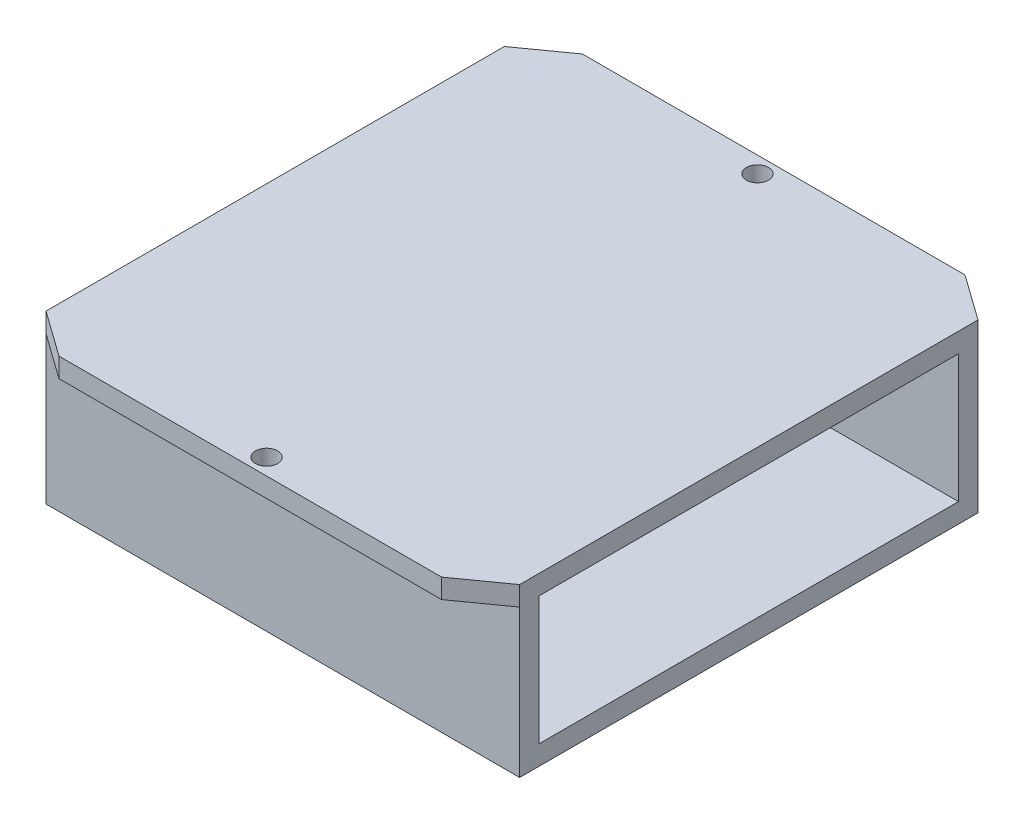
ISO-10303-21;
HEADER;
FILE_DESCRIPTION(('STEP AP214'),'2;1');
FILE_NAME('part.step','',(''),(''),'','','');
FILE_SCHEMA(('AUTOMOTIVE_DESIGN { 1 0 10303 214 1 1 1 1 }'));
ENDSEC;
DATA;
#1=APPLICATION_CONTEXT('core data for automotive mechanical design processes');
#2=APPLICATION_PROTOCOL_DEFINITION('international standard','automotive_design',2000,#1);
#3=PRODUCT_CONTEXT('',#1,'mechanical');
#4=PRODUCT('Part','Part','',(#3));
#5=PRODUCT_RELATED_PRODUCT_CATEGORY('part','',(#4));
#6=PRODUCT_DEFINITION_FORMATION('','',#4);
#7=PRODUCT_DEFINITION_CONTEXT('part definition',#1,'design');
#8=PRODUCT_DEFINITION('design','',#6,#7);
#9=PRODUCT_DEFINITION_SHAPE('','',#8);
#10=(LENGTH_UNIT() NAMED_UNIT(*) SI_UNIT(.MILLI.,.METRE.));
#11=(NAMED_UNIT(*) PLANE_ANGLE_UNIT() SI_UNIT($,.RADIAN.));
#12=(NAMED_UNIT(*) SI_UNIT($,.STERADIAN.) SOLID_ANGLE_UNIT());
#13=UNCERTAINTY_MEASURE_WITH_UNIT(LENGTH_MEASURE(1.E-05),#10,'distance_accuracy_value','');
#14=(GEOMETRIC_REPRESENTATION_CONTEXT(3) GLOBAL_UNCERTAINTY_ASSIGNED_CONTEXT((#13)) GLOBAL_UNIT_ASSIGNED_CONTEXT((#10,
#11,#12)) REPRESENTATION_CONTEXT('',''));
#15=CARTESIAN_POINT('',(0.,0.,0.));
#16=DIRECTION('',(0.,0.,1.));
#17=DIRECTION('',(1.,0.,0.));
#18=AXIS2_PLACEMENT_3D('',#15,#16,#17);
#19=CARTESIAN_POINT('',(69.85,0.,0.));
#20=DIRECTION('',(-1.,0.,0.));
#21=DIRECTION('',(0.,0.,1.));
#22=AXIS2_PLACEMENT_3D('',#19,#20,#21);
#23=PLANE('',#22);
#24=DIRECTION('',(0.,-1.,0.));
#25=VECTOR('',#24,1.);
#26=CARTESIAN_POINT('',(69.85,-3.,3.));
#27=LINE('',#26,#25);
#28=CARTESIAN_POINT('',(69.85,22.7,3.));
#29=VERTEX_POINT('',#28);
#30=CARTESIAN_POINT('',(69.85,19.7,3.));
#31=VERTEX_POINT('',#30);
#32=EDGE_CURVE('E253',#29,#31,#27,.T.);
#33=ORIENTED_EDGE('',*,*,#32,.T.);
#34=CARTESIAN_POINT('',(69.85,-3.,3.));
#35=VERTEX_POINT('',#34);
#36=EDGE_CURVE('E252',#31,#35,#27,.T.);
#37=ORIENTED_EDGE('',*,*,#36,.T.);
#38=DIRECTION('',(0.,0.,-1.));
#39=VECTOR('',#38,1.);
#40=CARTESIAN_POINT('',(69.85,-3.,3.));
#41=LINE('',#40,#39);
#42=CARTESIAN_POINT('',(69.85,-3.,-67.5));
#43=VERTEX_POINT('',#42);
#44=EDGE_CURVE('E256',#35,#43,#41,.T.);
#45=ORIENTED_EDGE('',*,*,#44,.T.);
#46=DIRECTION('',(0.,1.,0.));
#47=VECTOR('',#46,1.);
#48=CARTESIAN_POINT('',(69.85,-3.,-67.5));
#49=LINE('',#48,#47);
#50=CARTESIAN_POINT('',(69.85,19.7,-67.5));
#51=VERTEX_POINT('',#50);
#52=EDGE_CURVE('E258',#43,#51,#49,.T.);
#53=ORIENTED_EDGE('',*,*,#52,.T.);
#54=DIRECTION('',(0.,1.,0.));
#55=VECTOR('',#54,1.);
#56=CARTESIAN_POINT('',(69.85,19.7,-67.5));
#57=LINE('',#56,#55);
#58=CARTESIAN_POINT('',(69.85,22.7,-67.5));
#59=VERTEX_POINT('',#58);
#60=EDGE_CURVE('E150',#51,#59,#57,.T.);
#61=ORIENTED_EDGE('',*,*,#60,.T.);
#62=DIRECTION('',(0.,0.,1.));
#63=VECTOR('',#62,1.);
#64=CARTESIAN_POINT('',(69.85,22.7,3.));
#65=LINE('',#64,#63);
#66=EDGE_CURVE('E261',#59,#29,#65,.T.);
#67=ORIENTED_EDGE('',*,*,#66,.T.);
#68=EDGE_LOOP('',(#33,#37,#45,#53,#61,#67));
#69=FACE_BOUND('',#68,.T.);
#70=DIRECTION('',(0.,-1.,0.));
#71=VECTOR('',#70,1.);
#72=CARTESIAN_POINT('',(69.85,0.,0.));
#73=LINE('',#72,#71);
#74=CARTESIAN_POINT('',(69.85,19.7,0.));
#75=VERTEX_POINT('',#74);
#76=CARTESIAN_POINT('',(69.85,0.,0.));
#77=VERTEX_POINT('',#76);
#78=EDGE_CURVE('E221',#75,#77,#73,.T.);
#79=ORIENTED_EDGE('',*,*,#78,.F.);
#80=DIRECTION('',(0.,0.,1.));
#81=VECTOR('',#80,1.);
#82=CARTESIAN_POINT('',(69.85,19.7,0.));
#83=LINE('',#82,#81);
#84=CARTESIAN_POINT('',(69.85,19.7,-64.5));
#85=VERTEX_POINT('',#84);
#86=EDGE_CURVE('E229',#85,#75,#83,.T.);
#87=ORIENTED_EDGE('',*,*,#86,.F.);
#88=DIRECTION('',(0.,1.,0.));
#89=VECTOR('',#88,1.);
#90=CARTESIAN_POINT('',(69.85,0.,-64.5));
#91=LINE('',#90,#89);
#92=CARTESIAN_POINT('',(69.85,0.,-64.5));
#93=VERTEX_POINT('',#92);
#94=EDGE_CURVE('E226',#93,#85,#91,.T.);
#95=ORIENTED_EDGE('',*,*,#94,.F.);
#96=DIRECTION('',(0.,0.,-1.));
#97=VECTOR('',#96,1.);
#98=CARTESIAN_POINT('',(69.85,0.,0.));
#99=LINE('',#98,#97);
#100=EDGE_CURVE('E223',#77,#93,#99,.T.);
#101=ORIENTED_EDGE('',*,*,#100,.F.);
#102=EDGE_LOOP('',(#79,#87,#95,#101));
#103=FACE_BOUND('',#102,.T.);
#104=ADVANCED_FACE('F39',(#69,#103),#23,.F.);
#105=CARTESIAN_POINT('',(69.85,-3.,3.));
#106=DIRECTION('',(0.,0.,-1.));
#107=DIRECTION('',(-1.,0.,0.));
#108=AXIS2_PLACEMENT_3D('',#105,#106,#107);
#109=PLANE('',#108);
#110=ORIENTED_EDGE('',*,*,#36,.F.);
#111=DIRECTION('',(-1.,0.,0.));
#112=VECTOR('',#111,1.);
#113=CARTESIAN_POINT('',(-3.,19.7,3.));
#114=LINE('',#113,#112);
#115=CARTESIAN_POINT('',(-3.,19.7,3.));
#116=VERTEX_POINT('',#115);
#117=EDGE_CURVE('E197',#31,#116,#114,.T.);
#118=ORIENTED_EDGE('',*,*,#117,.T.);
#119=DIRECTION('',(0.,1.,0.));
#120=VECTOR('',#119,1.);
#121=CARTESIAN_POINT('',(-3.,-3.,3.));
#122=LINE('',#121,#120);
#123=CARTESIAN_POINT('',(-3.,-3.,3.));
#124=VERTEX_POINT('',#123);
#125=EDGE_CURVE('E210',#124,#116,#122,.T.);
#126=ORIENTED_EDGE('',*,*,#125,.F.);
#127=DIRECTION('',(-1.,0.,0.));
#128=VECTOR('',#127,1.);
#129=CARTESIAN_POINT('',(69.85,-3.,3.));
#130=LINE('',#129,#128);
#131=EDGE_CURVE('E11',#35,#124,#130,.T.);
#132=ORIENTED_EDGE('',*,*,#131,.F.);
#133=EDGE_LOOP('',(#110,#118,#126,#132));
#134=FACE_BOUND('',#133,.T.);
#135=ADVANCED_FACE('F41',(#134),#109,.F.);
#136=CARTESIAN_POINT('',(69.85,-3.,3.));
#137=DIRECTION('',(0.,1.,0.));
#138=DIRECTION('',(0.,0.,1.));
#139=AXIS2_PLACEMENT_3D('',#136,#137,#138);
#140=PLANE('',#139);
#141=ORIENTED_EDGE('',*,*,#131,.T.);
#142=DIRECTION('',(0.,0.,1.));
#143=VECTOR('',#142,1.);
#144=CARTESIAN_POINT('',(-3.,-3.,-67.5));
#145=LINE('',#144,#143);
#146=CARTESIAN_POINT('',(-3.,-3.,-67.5));
#147=VERTEX_POINT('',#146);
#148=EDGE_CURVE('E172',#147,#124,#145,.T.);
#149=ORIENTED_EDGE('',*,*,#148,.F.);
#150=DIRECTION('',(-1.,0.,0.));
#151=VECTOR('',#150,1.);
#152=CARTESIAN_POINT('',(69.85,-3.,-67.5));
#153=LINE('',#152,#151);
#154=EDGE_CURVE('E47',#43,#147,#153,.T.);
#155=ORIENTED_EDGE('',*,*,#154,.F.);
#156=ORIENTED_EDGE('',*,*,#44,.F.);
#157=EDGE_LOOP('',(#141,#149,#155,#156));
#158=FACE_BOUND('',#157,.T.);
#159=ADVANCED_FACE('F272',(#158),#140,.F.);
#160=CARTESIAN_POINT('',(69.85,-3.,-67.5));
#161=DIRECTION('',(0.,0.,1.));
#162=DIRECTION('',(1.,0.,0.));
#163=AXIS2_PLACEMENT_3D('',#160,#161,#162);
#164=PLANE('',#163);
#165=DIRECTION('',(0.,-1.,0.));
#166=VECTOR('',#165,1.);
#167=CARTESIAN_POINT('',(-3.,22.7,-67.5));
#168=LINE('',#167,#166);
#169=CARTESIAN_POINT('',(-3.,19.7,-67.5));
#170=VERTEX_POINT('',#169);
#171=EDGE_CURVE('E216',#170,#147,#168,.T.);
#172=ORIENTED_EDGE('',*,*,#171,.F.);
#173=DIRECTION('',(1.,0.,0.));
#174=VECTOR('',#173,1.);
#175=CARTESIAN_POINT('',(-3.,19.7,-67.5));
#176=LINE('',#175,#174);
#177=EDGE_CURVE('E159',#170,#51,#176,.T.);
#178=ORIENTED_EDGE('',*,*,#177,.T.);
#179=ORIENTED_EDGE('',*,*,#52,.F.);
#180=ORIENTED_EDGE('',*,*,#154,.T.);
#181=EDGE_LOOP('',(#172,#178,#179,#180));
#182=FACE_BOUND('',#181,.T.);
#183=ADVANCED_FACE('F269',(#182),#164,.F.);
#184=CARTESIAN_POINT('',(69.85,22.7,3.));
#185=DIRECTION('',(0.,-1.,0.));
#186=DIRECTION('',(0.,0.,-1.));
#187=AXIS2_PLACEMENT_3D('',#184,#185,#186);
#188=PLANE('',#187);
#189=ORIENTED_EDGE('',*,*,#66,.F.);
#190=DIRECTION('',(-0.813733471206735,0.,-0.581238193719096));
#191=VECTOR('',#190,1.);
#192=CARTESIAN_POINT('',(69.85,22.7,-67.5));
#193=LINE('',#192,#191);
#194=CARTESIAN_POINT('',(62.85,22.7,-72.5));
#195=VERTEX_POINT('',#194);
#196=EDGE_CURVE('E166',#59,#195,#193,.T.);
#197=ORIENTED_EDGE('',*,*,#196,.T.);
#198=DIRECTION('',(-1.,0.,0.));
#199=VECTOR('',#198,1.);
#200=CARTESIAN_POINT('',(62.85,22.7,-72.5));
#201=LINE('',#200,#199);
#202=CARTESIAN_POINT('',(4.,22.7,-72.5));
#203=VERTEX_POINT('',#202);
#204=EDGE_CURVE('E146',#195,#203,#201,.T.);
#205=ORIENTED_EDGE('',*,*,#204,.T.);
#206=DIRECTION('',(-0.813733471206735,0.,0.581238193719096));
#207=VECTOR('',#206,1.);
#208=CARTESIAN_POINT('',(4.,22.7,-72.5));
#209=LINE('',#208,#207);
#210=CARTESIAN_POINT('',(-3.,22.7,-67.5));
#211=VERTEX_POINT('',#210);
#212=EDGE_CURVE('E161',#203,#211,#209,.T.);
#213=ORIENTED_EDGE('',*,*,#212,.T.);
#214=DIRECTION('',(0.,0.,-1.));
#215=VECTOR('',#214,1.);
#216=CARTESIAN_POINT('',(-3.,22.7,3.));
#217=LINE('',#216,#215);
#218=CARTESIAN_POINT('',(-3.,22.7,3.));
#219=VERTEX_POINT('',#218);
#220=EDGE_CURVE('E213',#219,#211,#217,.T.);
#221=ORIENTED_EDGE('',*,*,#220,.F.);
#222=DIRECTION('',(0.813733471206735,0.,0.581238193719096));
#223=VECTOR('',#222,1.);
#224=CARTESIAN_POINT('',(4.,22.7,8.00000000000001));
#225=LINE('',#224,#223);
#226=CARTESIAN_POINT('',(4.,22.7,8.00000000000001));
#227=VERTEX_POINT('',#226);
#228=EDGE_CURVE('E186',#219,#227,#225,.T.);
#229=ORIENTED_EDGE('',*,*,#228,.T.);
#230=DIRECTION('',(1.,0.,0.));
#231=VECTOR('',#230,1.);
#232=CARTESIAN_POINT('',(62.85,22.7,8.00000000000001));
#233=LINE('',#232,#231);
#234=CARTESIAN_POINT('',(62.85,22.7,8.00000000000001));
#235=VERTEX_POINT('',#234);
#236=EDGE_CURVE('E183',#227,#235,#233,.T.);
#237=ORIENTED_EDGE('',*,*,#236,.T.);
#238=DIRECTION('',(0.813733471206735,0.,-0.581238193719096));
#239=VECTOR('',#238,1.);
#240=CARTESIAN_POINT('',(69.85,22.7,3.));
#241=LINE('',#240,#239);
#242=EDGE_CURVE('E190',#235,#29,#241,.T.);
#243=ORIENTED_EDGE('',*,*,#242,.T.);
#244=EDGE_LOOP('',(#189,#197,#205,#213,#221,#229,#237,#243));
#245=FACE_BOUND('',#244,.T.);
#246=CARTESIAN_POINT('',(33.425,22.7,-70.));
#247=DIRECTION('',(0.,1.,0.));
#248=DIRECTION('',(0.,0.,1.));
#249=AXIS2_PLACEMENT_3D('',#246,#247,#248);
#250=CIRCLE('',#249,1.69999999999999);
#251=CARTESIAN_POINT('',(33.425,22.7,-68.3));
#252=VERTEX_POINT('',#251);
#253=EDGE_CURVE('E205',#252,#252,#250,.T.);
#254=ORIENTED_EDGE('',*,*,#253,.F.);
#255=EDGE_LOOP('',(#254));
#256=FACE_BOUND('',#255,.T.);
#257=CARTESIAN_POINT('',(33.425,22.7,5.50000000000001));
#258=DIRECTION('',(0.,1.,0.));
#259=DIRECTION('',(0.,0.,-1.));
#260=AXIS2_PLACEMENT_3D('',#257,#258,#259);
#261=CIRCLE('',#260,1.69999999999999);
#262=CARTESIAN_POINT('',(33.425,22.7,3.80000000000001));
#263=VERTEX_POINT('',#262);
#264=EDGE_CURVE('E202',#263,#263,#261,.T.);
#265=ORIENTED_EDGE('',*,*,#264,.F.);
#266=EDGE_LOOP('',(#265));
#267=FACE_BOUND('',#266,.T.);
#268=ADVANCED_FACE('F283',(#245,#256,#267),#188,.F.);
#269=CARTESIAN_POINT('',(69.85,0.,0.));
#270=DIRECTION('',(0.,0.,-1.));
#271=DIRECTION('',(-1.,0.,0.));
#272=AXIS2_PLACEMENT_3D('',#269,#270,#271);
#273=PLANE('',#272);
#274=DIRECTION('',(0.,-1.,0.));
#275=VECTOR('',#274,1.);
#276=CARTESIAN_POINT('',(0.,0.,0.));
#277=LINE('',#276,#275);
#278=CARTESIAN_POINT('',(0.,19.7,0.));
#279=VERTEX_POINT('',#278);
#280=CARTESIAN_POINT('',(0.,0.,0.));
#281=VERTEX_POINT('',#280);
#282=EDGE_CURVE('E220',#279,#281,#277,.T.);
#283=ORIENTED_EDGE('',*,*,#282,.F.);
#284=DIRECTION('',(-1.,0.,0.));
#285=VECTOR('',#284,1.);
#286=CARTESIAN_POINT('',(69.85,19.7,0.));
#287=LINE('',#286,#285);
#288=EDGE_CURVE('E231',#75,#279,#287,.T.);
#289=ORIENTED_EDGE('',*,*,#288,.F.);
#290=ORIENTED_EDGE('',*,*,#78,.T.);
#291=DIRECTION('',(-1.,0.,0.));
#292=VECTOR('',#291,1.);
#293=CARTESIAN_POINT('',(69.85,0.,0.));
#294=LINE('',#293,#292);
#295=EDGE_CURVE('E249',#77,#281,#294,.T.);
#296=ORIENTED_EDGE('',*,*,#295,.T.);
#297=EDGE_LOOP('',(#283,#289,#290,#296));
#298=FACE_BOUND('',#297,.T.);
#299=ADVANCED_FACE('F318',(#298),#273,.T.);
#300=CARTESIAN_POINT('',(69.85,0.,0.));
#301=DIRECTION('',(0.,1.,0.));
#302=DIRECTION('',(0.,0.,1.));
#303=AXIS2_PLACEMENT_3D('',#300,#301,#302);
#304=PLANE('',#303);
#305=DIRECTION('',(0.,0.,-1.));
#306=VECTOR('',#305,1.);
#307=CARTESIAN_POINT('',(0.,0.,0.));
#308=LINE('',#307,#306);
#309=CARTESIAN_POINT('',(0.,0.,-64.5));
#310=VERTEX_POINT('',#309);
#311=EDGE_CURVE('E234',#281,#310,#308,.T.);
#312=ORIENTED_EDGE('',*,*,#311,.F.);
#313=ORIENTED_EDGE('',*,*,#295,.F.);
#314=ORIENTED_EDGE('',*,*,#100,.T.);
#315=DIRECTION('',(-1.,0.,0.));
#316=VECTOR('',#315,1.);
#317=CARTESIAN_POINT('',(69.85,0.,-64.5));
#318=LINE('',#317,#316);
#319=EDGE_CURVE('E247',#93,#310,#318,.T.);
#320=ORIENTED_EDGE('',*,*,#319,.T.);
#321=EDGE_LOOP('',(#312,#313,#314,#320));
#322=FACE_BOUND('',#321,.T.);
#323=ADVANCED_FACE('F335',(#322),#304,.T.);
#324=CARTESIAN_POINT('',(69.85,0.,-64.5));
#325=DIRECTION('',(0.,0.,1.));
#326=DIRECTION('',(1.,0.,0.));
#327=AXIS2_PLACEMENT_3D('',#324,#325,#326);
#328=PLANE('',#327);
#329=DIRECTION('',(0.,1.,0.));
#330=VECTOR('',#329,1.);
#331=CARTESIAN_POINT('',(0.,0.,-64.5));
#332=LINE('',#331,#330);
#333=CARTESIAN_POINT('',(0.,19.7,-64.5));
#334=VERTEX_POINT('',#333);
#335=EDGE_CURVE('E237',#310,#334,#332,.T.);
#336=ORIENTED_EDGE('',*,*,#335,.F.);
#337=ORIENTED_EDGE('',*,*,#319,.F.);
#338=ORIENTED_EDGE('',*,*,#94,.T.);
#339=DIRECTION('',(-1.,0.,0.));
#340=VECTOR('',#339,1.);
#341=CARTESIAN_POINT('',(69.85,19.7,-64.5));
#342=LINE('',#341,#340);
#343=EDGE_CURVE('E244',#85,#334,#342,.T.);
#344=ORIENTED_EDGE('',*,*,#343,.T.);
#345=EDGE_LOOP('',(#336,#337,#338,#344));
#346=FACE_BOUND('',#345,.T.);
#347=ADVANCED_FACE('F344',(#346),#328,.T.);
#348=CARTESIAN_POINT('',(69.85,19.7,0.));
#349=DIRECTION('',(0.,-1.,0.));
#350=DIRECTION('',(0.,0.,-1.));
#351=AXIS2_PLACEMENT_3D('',#348,#349,#350);
#352=PLANE('',#351);
#353=DIRECTION('',(0.,0.,1.));
#354=VECTOR('',#353,1.);
#355=CARTESIAN_POINT('',(0.,19.7,0.));
#356=LINE('',#355,#354);
#357=EDGE_CURVE('E224',#334,#279,#356,.T.);
#358=ORIENTED_EDGE('',*,*,#357,.F.);
#359=ORIENTED_EDGE('',*,*,#343,.F.);
#360=ORIENTED_EDGE('',*,*,#86,.T.);
#361=ORIENTED_EDGE('',*,*,#288,.T.);
#362=EDGE_LOOP('',(#358,#359,#360,#361));
#363=FACE_BOUND('',#362,.T.);
#364=ADVANCED_FACE('F352',(#363),#352,.T.);
#365=CARTESIAN_POINT('',(0.,0.,0.));
#366=DIRECTION('',(-1.,0.,0.));
#367=DIRECTION('',(0.,0.,1.));
#368=AXIS2_PLACEMENT_3D('',#365,#366,#367);
#369=PLANE('',#368);
#370=ORIENTED_EDGE('',*,*,#335,.T.);
#371=ORIENTED_EDGE('',*,*,#357,.T.);
#372=ORIENTED_EDGE('',*,*,#282,.T.);
#373=ORIENTED_EDGE('',*,*,#311,.T.);
#374=EDGE_LOOP('',(#370,#371,#372,#373));
#375=FACE_BOUND('',#374,.T.);
#376=ADVANCED_FACE('F360',(#375),#369,.F.);
#377=CARTESIAN_POINT('',(-3.,0.,0.));
#378=DIRECTION('',(-1.,0.,0.));
#379=DIRECTION('',(0.,0.,1.));
#380=AXIS2_PLACEMENT_3D('',#377,#378,#379);
#381=PLANE('',#380);
#382=ORIENTED_EDGE('',*,*,#148,.T.);
#383=ORIENTED_EDGE('',*,*,#125,.T.);
#384=DIRECTION('',(0.,1.,0.));
#385=VECTOR('',#384,1.);
#386=CARTESIAN_POINT('',(-3.,19.7,3.));
#387=LINE('',#386,#385);
#388=EDGE_CURVE('E175',#116,#219,#387,.T.);
#389=ORIENTED_EDGE('',*,*,#388,.T.);
#390=ORIENTED_EDGE('',*,*,#220,.T.);
#391=EDGE_CURVE('E217',#211,#170,#168,.T.);
#392=ORIENTED_EDGE('',*,*,#391,.T.);
#393=ORIENTED_EDGE('',*,*,#171,.T.);
#394=EDGE_LOOP('',(#382,#383,#389,#390,#392,#393));
#395=FACE_BOUND('',#394,.T.);
#396=ADVANCED_FACE('F276',(#395),#381,.T.);
#397=CARTESIAN_POINT('',(4.,19.7,-72.5));
#398=DIRECTION('',(-0.581238193719096,0.,-0.813733471206735));
#399=DIRECTION('',(-0.813733471206735,0.,0.581238193719096));
#400=AXIS2_PLACEMENT_3D('',#397,#398,#399);
#401=PLANE('',#400);
#402=ORIENTED_EDGE('',*,*,#212,.F.);
#403=DIRECTION('',(0.,1.,0.));
#404=VECTOR('',#403,1.);
#405=CARTESIAN_POINT('',(4.,19.7,-72.5));
#406=LINE('',#405,#404);
#407=CARTESIAN_POINT('',(4.,19.7,-72.5));
#408=VERTEX_POINT('',#407);
#409=EDGE_CURVE('E149',#408,#203,#406,.T.);
#410=ORIENTED_EDGE('',*,*,#409,.F.);
#411=DIRECTION('',(-0.813733471206735,0.,0.581238193719096));
#412=VECTOR('',#411,1.);
#413=CARTESIAN_POINT('',(4.,19.7,-72.5));
#414=LINE('',#413,#412);
#415=EDGE_CURVE('E154',#408,#170,#414,.T.);
#416=ORIENTED_EDGE('',*,*,#415,.T.);
#417=ORIENTED_EDGE('',*,*,#391,.F.);
#418=EDGE_LOOP('',(#402,#410,#416,#417));
#419=FACE_BOUND('',#418,.T.);
#420=ADVANCED_FACE('F280',(#419),#401,.T.);
#421=CARTESIAN_POINT('',(62.85,19.7,-72.5));
#422=DIRECTION('',(0.,0.,-1.));
#423=DIRECTION('',(-1.,0.,0.));
#424=AXIS2_PLACEMENT_3D('',#421,#422,#423);
#425=PLANE('',#424);
#426=ORIENTED_EDGE('',*,*,#204,.F.);
#427=DIRECTION('',(0.,1.,0.));
#428=VECTOR('',#427,1.);
#429=CARTESIAN_POINT('',(62.85,19.7,-72.5));
#430=LINE('',#429,#428);
#431=CARTESIAN_POINT('',(62.85,19.7,-72.5));
#432=VERTEX_POINT('',#431);
#433=EDGE_CURVE('E141',#432,#195,#430,.T.);
#434=ORIENTED_EDGE('',*,*,#433,.F.);
#435=DIRECTION('',(-1.,0.,0.));
#436=VECTOR('',#435,1.);
#437=CARTESIAN_POINT('',(62.85,19.7,-72.5));
#438=LINE('',#437,#436);
#439=EDGE_CURVE('E143',#432,#408,#438,.T.);
#440=ORIENTED_EDGE('',*,*,#439,.T.);
#441=ORIENTED_EDGE('',*,*,#409,.T.);
#442=EDGE_LOOP('',(#426,#434,#440,#441));
#443=FACE_BOUND('',#442,.T.);
#444=ADVANCED_FACE('F142',(#443),#425,.T.);
#445=CARTESIAN_POINT('',(69.85,19.7,-67.5));
#446=DIRECTION('',(0.581238193719096,0.,-0.813733471206735));
#447=DIRECTION('',(-0.813733471206735,0.,-0.581238193719096));
#448=AXIS2_PLACEMENT_3D('',#445,#446,#447);
#449=PLANE('',#448);
#450=ORIENTED_EDGE('',*,*,#196,.F.);
#451=ORIENTED_EDGE('',*,*,#60,.F.);
#452=DIRECTION('',(-0.813733471206735,0.,-0.581238193719096));
#453=VECTOR('',#452,1.);
#454=CARTESIAN_POINT('',(69.85,19.7,-67.5));
#455=LINE('',#454,#453);
#456=EDGE_CURVE('E62',#51,#432,#455,.T.);
#457=ORIENTED_EDGE('',*,*,#456,.T.);
#458=ORIENTED_EDGE('',*,*,#433,.T.);
#459=EDGE_LOOP('',(#450,#451,#457,#458));
#460=FACE_BOUND('',#459,.T.);
#461=ADVANCED_FACE('F156',(#460),#449,.T.);
#462=CARTESIAN_POINT('',(0.,19.7,0.));
#463=DIRECTION('',(0.,1.,0.));
#464=DIRECTION('',(0.,0.,1.));
#465=AXIS2_PLACEMENT_3D('',#462,#463,#464);
#466=PLANE('',#465);
#467=CARTESIAN_POINT('',(33.425,19.7,-70.));
#468=DIRECTION('',(0.,1.,0.));
#469=DIRECTION('',(0.,0.,1.));
#470=AXIS2_PLACEMENT_3D('',#467,#468,#469);
#471=CIRCLE('',#470,1.69999999999999);
#472=CARTESIAN_POINT('',(33.425,19.7,-68.3));
#473=VERTEX_POINT('',#472);
#474=EDGE_CURVE('E168',#473,#473,#471,.T.);
#475=ORIENTED_EDGE('',*,*,#474,.T.);
#476=EDGE_LOOP('',(#475));
#477=FACE_BOUND('',#476,.T.);
#478=ORIENTED_EDGE('',*,*,#177,.F.);
#479=ORIENTED_EDGE('',*,*,#415,.F.);
#480=ORIENTED_EDGE('',*,*,#439,.F.);
#481=ORIENTED_EDGE('',*,*,#456,.F.);
#482=EDGE_LOOP('',(#478,#479,#480,#481));
#483=FACE_BOUND('',#482,.T.);
#484=ADVANCED_FACE('F152',(#477,#483),#466,.F.);
#485=CARTESIAN_POINT('',(33.425,19.7,-70.));
#486=DIRECTION('',(0.,1.,0.));
#487=DIRECTION('',(0.,0.,1.));
#488=AXIS2_PLACEMENT_3D('',#485,#486,#487);
#489=CYLINDRICAL_SURFACE('',#488,1.69999999999999);
#490=ORIENTED_EDGE('',*,*,#474,.F.);
#491=EDGE_LOOP('',(#490));
#492=FACE_BOUND('',#491,.T.);
#493=ORIENTED_EDGE('',*,*,#253,.T.);
#494=EDGE_LOOP('',(#493));
#495=FACE_BOUND('',#494,.T.);
#496=ADVANCED_FACE('F422',(#492,#495),#489,.F.);
#497=CARTESIAN_POINT('',(69.85,19.7,3.));
#498=DIRECTION('',(0.581238193719096,0.,0.813733471206735));
#499=DIRECTION('',(0.813733471206735,0.,-0.581238193719096));
#500=AXIS2_PLACEMENT_3D('',#497,#498,#499);
#501=PLANE('',#500);
#502=ORIENTED_EDGE('',*,*,#242,.F.);
#503=DIRECTION('',(0.,1.,0.));
#504=VECTOR('',#503,1.);
#505=CARTESIAN_POINT('',(62.85,19.7,8.00000000000001));
#506=LINE('',#505,#504);
#507=CARTESIAN_POINT('',(62.85,19.7,8.00000000000001));
#508=VERTEX_POINT('',#507);
#509=EDGE_CURVE('E181',#508,#235,#506,.T.);
#510=ORIENTED_EDGE('',*,*,#509,.F.);
#511=DIRECTION('',(0.813733471206735,0.,-0.581238193719096));
#512=VECTOR('',#511,1.);
#513=CARTESIAN_POINT('',(69.85,19.7,3.));
#514=LINE('',#513,#512);
#515=EDGE_CURVE('E187',#508,#31,#514,.T.);
#516=ORIENTED_EDGE('',*,*,#515,.T.);
#517=ORIENTED_EDGE('',*,*,#32,.F.);
#518=EDGE_LOOP('',(#502,#510,#516,#517));
#519=FACE_BOUND('',#518,.T.);
#520=ADVANCED_FACE('F293',(#519),#501,.T.);
#521=CARTESIAN_POINT('',(62.85,19.7,8.00000000000001));
#522=DIRECTION('',(0.,0.,1.));
#523=DIRECTION('',(1.,0.,0.));
#524=AXIS2_PLACEMENT_3D('',#521,#522,#523);
#525=PLANE('',#524);
#526=ORIENTED_EDGE('',*,*,#236,.F.);
#527=DIRECTION('',(0.,1.,0.));
#528=VECTOR('',#527,1.);
#529=CARTESIAN_POINT('',(4.,19.7,8.00000000000001));
#530=LINE('',#529,#528);
#531=CARTESIAN_POINT('',(4.,19.7,8.00000000000001));
#532=VERTEX_POINT('',#531);
#533=EDGE_CURVE('E179',#532,#227,#530,.T.);
#534=ORIENTED_EDGE('',*,*,#533,.F.);
#535=DIRECTION('',(1.,0.,0.));
#536=VECTOR('',#535,1.);
#537=CARTESIAN_POINT('',(62.85,19.7,8.00000000000001));
#538=LINE('',#537,#536);
#539=EDGE_CURVE('E178',#532,#508,#538,.T.);
#540=ORIENTED_EDGE('',*,*,#539,.T.);
#541=ORIENTED_EDGE('',*,*,#509,.T.);
#542=EDGE_LOOP('',(#526,#534,#540,#541));
#543=FACE_BOUND('',#542,.T.);
#544=ADVANCED_FACE('F296',(#543),#525,.T.);
#545=CARTESIAN_POINT('',(4.,19.7,8.00000000000001));
#546=DIRECTION('',(-0.581238193719096,0.,0.813733471206735));
#547=DIRECTION('',(0.813733471206735,0.,0.581238193719096));
#548=AXIS2_PLACEMENT_3D('',#545,#546,#547);
#549=PLANE('',#548);
#550=ORIENTED_EDGE('',*,*,#228,.F.);
#551=ORIENTED_EDGE('',*,*,#388,.F.);
#552=DIRECTION('',(0.813733471206735,0.,0.581238193719096));
#553=VECTOR('',#552,1.);
#554=CARTESIAN_POINT('',(4.,19.7,8.00000000000001));
#555=LINE('',#554,#553);
#556=EDGE_CURVE('E54',#116,#532,#555,.T.);
#557=ORIENTED_EDGE('',*,*,#556,.T.);
#558=ORIENTED_EDGE('',*,*,#533,.T.);
#559=EDGE_LOOP('',(#550,#551,#557,#558));
#560=FACE_BOUND('',#559,.T.);
#561=ADVANCED_FACE('F298',(#560),#549,.T.);
#562=CARTESIAN_POINT('',(0.,19.7,0.));
#563=DIRECTION('',(0.,-1.,0.));
#564=DIRECTION('',(0.,0.,-1.));
#565=AXIS2_PLACEMENT_3D('',#562,#563,#564);
#566=PLANE('',#565);
#567=CARTESIAN_POINT('',(33.425,19.7,5.50000000000001));
#568=DIRECTION('',(0.,1.,0.));
#569=DIRECTION('',(0.,0.,-1.));
#570=AXIS2_PLACEMENT_3D('',#567,#568,#569);
#571=CIRCLE('',#570,1.69999999999999);
#572=CARTESIAN_POINT('',(33.425,19.7,3.80000000000001));
#573=VERTEX_POINT('',#572);
#574=EDGE_CURVE('E193',#573,#573,#571,.T.);
#575=ORIENTED_EDGE('',*,*,#574,.T.);
#576=EDGE_LOOP('',(#575));
#577=FACE_BOUND('',#576,.T.);
#578=ORIENTED_EDGE('',*,*,#515,.F.);
#579=ORIENTED_EDGE('',*,*,#539,.F.);
#580=ORIENTED_EDGE('',*,*,#556,.F.);
#581=ORIENTED_EDGE('',*,*,#117,.F.);
#582=EDGE_LOOP('',(#578,#579,#580,#581));
#583=FACE_BOUND('',#582,.T.);
#584=ADVANCED_FACE('F290',(#577,#583),#566,.T.);
#585=CARTESIAN_POINT('',(33.425,19.7,5.50000000000001));
#586=DIRECTION('',(0.,1.,0.));
#587=DIRECTION('',(0.,0.,1.));
#588=AXIS2_PLACEMENT_3D('',#585,#586,#587);
#589=CYLINDRICAL_SURFACE('',#588,1.69999999999999);
#590=ORIENTED_EDGE('',*,*,#574,.F.);
#591=EDGE_LOOP('',(#590));
#592=FACE_BOUND('',#591,.T.);
#593=ORIENTED_EDGE('',*,*,#264,.T.);
#594=EDGE_LOOP('',(#593));
#595=FACE_BOUND('',#594,.T.);
#596=ADVANCED_FACE('F305',(#592,#595),#589,.F.);
#597=CLOSED_SHELL('',(#104,#135,#159,#183,#268,#299,#323,#347,#364,#376,#396,#420,#444,#461,
#484,#496,#520,#544,#561,#584,#596));
#598=MANIFOLD_SOLID_BREP('B2',#597);
#599=ADVANCED_BREP_SHAPE_REPRESENTATION('',(#18,#598),#14);
#600=SHAPE_DEFINITION_REPRESENTATION(#9,#599);
ENDSEC;
END-ISO-10303-21;
